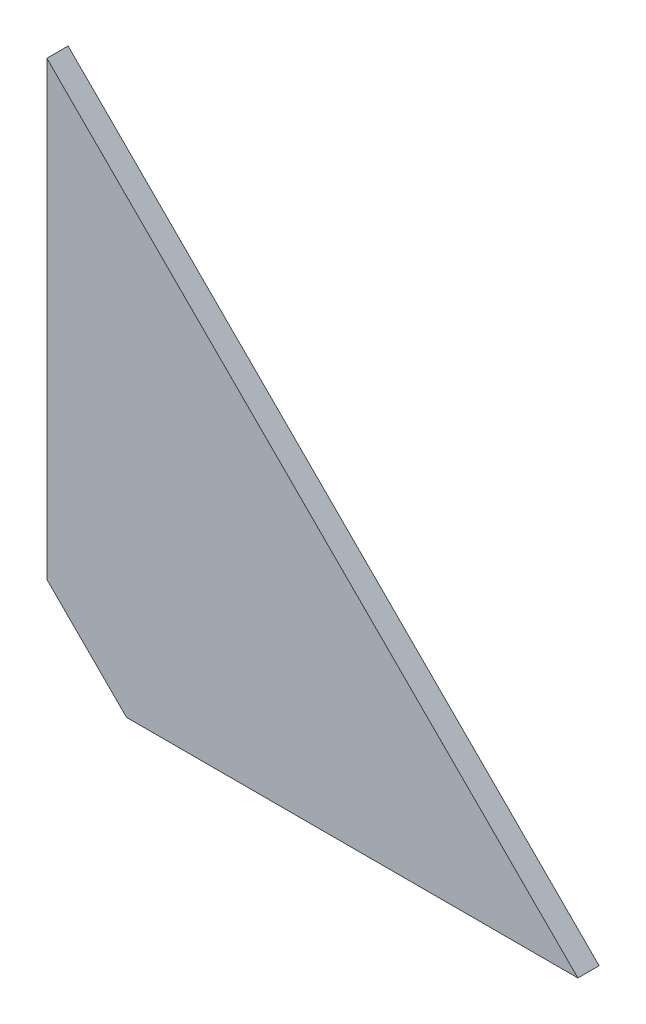
ISO-10303-21;
HEADER;
FILE_DESCRIPTION(('STEP AP214'),'2;1');
FILE_NAME('part.step','',(''),(''),'','','');
FILE_SCHEMA(('AUTOMOTIVE_DESIGN { 1 0 10303 214 1 1 1 1 }'));
ENDSEC;
DATA;
#1=APPLICATION_CONTEXT('core data for automotive mechanical design processes');
#2=APPLICATION_PROTOCOL_DEFINITION('international standard','automotive_design',2000,#1);
#3=PRODUCT_CONTEXT('',#1,'mechanical');
#4=PRODUCT('Part','Part','',(#3));
#5=PRODUCT_RELATED_PRODUCT_CATEGORY('part','',(#4));
#6=PRODUCT_DEFINITION_FORMATION('','',#4);
#7=PRODUCT_DEFINITION_CONTEXT('part definition',#1,'design');
#8=PRODUCT_DEFINITION('design','',#6,#7);
#9=PRODUCT_DEFINITION_SHAPE('','',#8);
#10=(LENGTH_UNIT() NAMED_UNIT(*) SI_UNIT(.MILLI.,.METRE.));
#11=(NAMED_UNIT(*) PLANE_ANGLE_UNIT() SI_UNIT($,.RADIAN.));
#12=(NAMED_UNIT(*) SI_UNIT($,.STERADIAN.) SOLID_ANGLE_UNIT());
#13=UNCERTAINTY_MEASURE_WITH_UNIT(LENGTH_MEASURE(1.E-05),#10,'distance_accuracy_value','');
#14=(GEOMETRIC_REPRESENTATION_CONTEXT(3) GLOBAL_UNCERTAINTY_ASSIGNED_CONTEXT((#13)) GLOBAL_UNIT_ASSIGNED_CONTEXT((#10,
#11,#12)) REPRESENTATION_CONTEXT('',''));
#15=CARTESIAN_POINT('',(0.,0.,0.));
#16=DIRECTION('',(0.,0.,1.));
#17=DIRECTION('',(1.,0.,0.));
#18=AXIS2_PLACEMENT_3D('',#15,#16,#17);
#19=CARTESIAN_POINT('',(0.,29.9999999999999,8.));
#20=DIRECTION('',(1.,0.,0.));
#21=DIRECTION('',(0.,0.,-1.));
#22=AXIS2_PLACEMENT_3D('',#19,#20,#21);
#23=PLANE('',#22);
#24=DIRECTION('',(0.,-1.,0.));
#25=VECTOR('',#24,1.);
#26=CARTESIAN_POINT('',(0.,29.9999999999999,0.));
#27=LINE('',#26,#25);
#28=CARTESIAN_POINT('',(0.,200.,0.));
#29=VERTEX_POINT('',#28);
#30=CARTESIAN_POINT('',(0.,29.9999999999999,0.));
#31=VERTEX_POINT('',#30);
#32=EDGE_CURVE('E77',#29,#31,#27,.T.);
#33=ORIENTED_EDGE('',*,*,#32,.T.);
#34=DIRECTION('',(0.,0.,-1.));
#35=VECTOR('',#34,1.);
#36=CARTESIAN_POINT('',(0.,29.9999999999999,8.));
#37=LINE('',#36,#35);
#38=CARTESIAN_POINT('',(0.,29.9999999999999,8.));
#39=VERTEX_POINT('',#38);
#40=EDGE_CURVE('E11',#39,#31,#37,.T.);
#41=ORIENTED_EDGE('',*,*,#40,.F.);
#42=DIRECTION('',(0.,-1.,0.));
#43=VECTOR('',#42,1.);
#44=CARTESIAN_POINT('',(0.,29.9999999999999,8.));
#45=LINE('',#44,#43);
#46=CARTESIAN_POINT('',(0.,200.,8.));
#47=VERTEX_POINT('',#46);
#48=EDGE_CURVE('E95',#47,#39,#45,.T.);
#49=ORIENTED_EDGE('',*,*,#48,.F.);
#50=DIRECTION('',(0.,0.,-1.));
#51=VECTOR('',#50,1.);
#52=CARTESIAN_POINT('',(0.,200.,8.));
#53=LINE('',#52,#51);
#54=EDGE_CURVE('E89',#47,#29,#53,.T.);
#55=ORIENTED_EDGE('',*,*,#54,.T.);
#56=EDGE_LOOP('',(#33,#41,#49,#55));
#57=FACE_BOUND('',#56,.T.);
#58=ADVANCED_FACE('F33',(#57),#23,.F.);
#59=CARTESIAN_POINT('',(29.9999999999999,0.,8.));
#60=DIRECTION('',(0.707106781186547,0.707106781186547,0.));
#61=DIRECTION('',(-0.707106781186548,0.707106781186548,0.));
#62=AXIS2_PLACEMENT_3D('',#59,#60,#61);
#63=PLANE('',#62);
#64=DIRECTION('',(0.707106781186548,-0.707106781186548,0.));
#65=VECTOR('',#64,1.);
#66=CARTESIAN_POINT('',(29.9999999999999,0.,0.));
#67=LINE('',#66,#65);
#68=CARTESIAN_POINT('',(29.9999999999999,0.,0.));
#69=VERTEX_POINT('',#68);
#70=EDGE_CURVE('E73',#31,#69,#67,.T.);
#71=ORIENTED_EDGE('',*,*,#70,.T.);
#72=DIRECTION('',(0.,0.,-1.));
#73=VECTOR('',#72,1.);
#74=CARTESIAN_POINT('',(29.9999999999999,0.,8.));
#75=LINE('',#74,#73);
#76=CARTESIAN_POINT('',(29.9999999999999,0.,8.));
#77=VERTEX_POINT('',#76);
#78=EDGE_CURVE('E40',#77,#69,#75,.T.);
#79=ORIENTED_EDGE('',*,*,#78,.F.);
#80=DIRECTION('',(0.707106781186548,-0.707106781186548,0.));
#81=VECTOR('',#80,1.);
#82=CARTESIAN_POINT('',(29.9999999999999,0.,8.));
#83=LINE('',#82,#81);
#84=EDGE_CURVE('E85',#39,#77,#83,.T.);
#85=ORIENTED_EDGE('',*,*,#84,.F.);
#86=ORIENTED_EDGE('',*,*,#40,.T.);
#87=EDGE_LOOP('',(#71,#79,#85,#86));
#88=FACE_BOUND('',#87,.T.);
#89=ADVANCED_FACE('F84',(#88),#63,.F.);
#90=CARTESIAN_POINT('',(29.9999999999999,0.,8.));
#91=DIRECTION('',(0.,1.,0.));
#92=DIRECTION('',(0.,0.,1.));
#93=AXIS2_PLACEMENT_3D('',#90,#91,#92);
#94=PLANE('',#93);
#95=DIRECTION('',(1.,0.,0.));
#96=VECTOR('',#95,1.);
#97=CARTESIAN_POINT('',(29.9999999999999,0.,0.));
#98=LINE('',#97,#96);
#99=CARTESIAN_POINT('',(200.,0.,0.));
#100=VERTEX_POINT('',#99);
#101=EDGE_CURVE('E78',#69,#100,#98,.T.);
#102=ORIENTED_EDGE('',*,*,#101,.T.);
#103=DIRECTION('',(0.,0.,-1.));
#104=VECTOR('',#103,1.);
#105=CARTESIAN_POINT('',(200.,0.,8.));
#106=LINE('',#105,#104);
#107=CARTESIAN_POINT('',(200.,0.,8.));
#108=VERTEX_POINT('',#107);
#109=EDGE_CURVE('E101',#108,#100,#106,.T.);
#110=ORIENTED_EDGE('',*,*,#109,.F.);
#111=DIRECTION('',(1.,0.,0.));
#112=VECTOR('',#111,1.);
#113=CARTESIAN_POINT('',(29.9999999999999,0.,8.));
#114=LINE('',#113,#112);
#115=EDGE_CURVE('E52',#77,#108,#114,.T.);
#116=ORIENTED_EDGE('',*,*,#115,.F.);
#117=ORIENTED_EDGE('',*,*,#78,.T.);
#118=EDGE_LOOP('',(#102,#110,#116,#117));
#119=FACE_BOUND('',#118,.T.);
#120=ADVANCED_FACE('F104',(#119),#94,.F.);
#121=CARTESIAN_POINT('',(0.,200.,8.));
#122=DIRECTION('',(-0.707106781186547,-0.707106781186547,0.));
#123=DIRECTION('',(0.707106781186548,-0.707106781186548,0.));
#124=AXIS2_PLACEMENT_3D('',#121,#122,#123);
#125=PLANE('',#124);
#126=DIRECTION('',(-0.707106781186547,0.707106781186547,0.));
#127=VECTOR('',#126,1.);
#128=CARTESIAN_POINT('',(0.,200.,0.));
#129=LINE('',#128,#127);
#130=EDGE_CURVE('E93',#100,#29,#129,.T.);
#131=ORIENTED_EDGE('',*,*,#130,.T.);
#132=ORIENTED_EDGE('',*,*,#54,.F.);
#133=DIRECTION('',(-0.707106781186547,0.707106781186547,0.));
#134=VECTOR('',#133,1.);
#135=CARTESIAN_POINT('',(0.,200.,8.));
#136=LINE('',#135,#134);
#137=EDGE_CURVE('E47',#108,#47,#136,.T.);
#138=ORIENTED_EDGE('',*,*,#137,.F.);
#139=ORIENTED_EDGE('',*,*,#109,.T.);
#140=EDGE_LOOP('',(#131,#132,#138,#139));
#141=FACE_BOUND('',#140,.T.);
#142=ADVANCED_FACE('F106',(#141),#125,.F.);
#143=CARTESIAN_POINT('',(0.,0.,8.));
#144=DIRECTION('',(0.,0.,-1.));
#145=DIRECTION('',(-1.,0.,0.));
#146=AXIS2_PLACEMENT_3D('',#143,#144,#145);
#147=PLANE('',#146);
#148=ORIENTED_EDGE('',*,*,#48,.T.);
#149=ORIENTED_EDGE('',*,*,#84,.T.);
#150=ORIENTED_EDGE('',*,*,#115,.T.);
#151=ORIENTED_EDGE('',*,*,#137,.T.);
#152=EDGE_LOOP('',(#148,#149,#150,#151));
#153=FACE_BOUND('',#152,.T.);
#154=ADVANCED_FACE('F107',(#153),#147,.F.);
#155=CARTESIAN_POINT('',(0.,0.,0.));
#156=DIRECTION('',(0.,0.,-1.));
#157=DIRECTION('',(-1.,0.,0.));
#158=AXIS2_PLACEMENT_3D('',#155,#156,#157);
#159=PLANE('',#158);
#160=ORIENTED_EDGE('',*,*,#32,.F.);
#161=ORIENTED_EDGE('',*,*,#130,.F.);
#162=ORIENTED_EDGE('',*,*,#101,.F.);
#163=ORIENTED_EDGE('',*,*,#70,.F.);
#164=EDGE_LOOP('',(#160,#161,#162,#163));
#165=FACE_BOUND('',#164,.T.);
#166=ADVANCED_FACE('F74',(#165),#159,.T.);
#167=CLOSED_SHELL('',(#58,#89,#120,#142,#154,#166));
#168=MANIFOLD_SOLID_BREP('B2',#167);
#169=ADVANCED_BREP_SHAPE_REPRESENTATION('',(#18,#168),#14);
#170=SHAPE_DEFINITION_REPRESENTATION(#9,#169);
ENDSEC;
END-ISO-10303-21;
